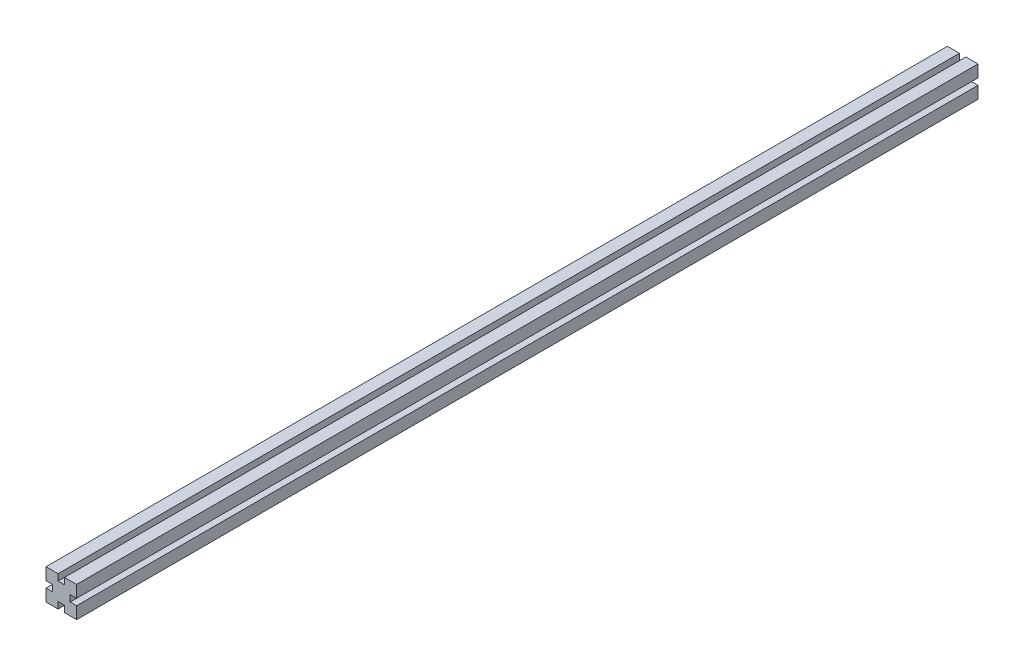
ISO-10303-21;
HEADER;
FILE_DESCRIPTION(('STEP AP214'),'2;1');
FILE_NAME('part.step','',(''),(''),'','','');
FILE_SCHEMA(('AUTOMOTIVE_DESIGN { 1 0 10303 214 1 1 1 1 }'));
ENDSEC;
DATA;
#1=APPLICATION_CONTEXT('core data for automotive mechanical design processes');
#2=APPLICATION_PROTOCOL_DEFINITION('international standard','automotive_design',2000,#1);
#3=PRODUCT_CONTEXT('',#1,'mechanical');
#4=PRODUCT('Part','Part','',(#3));
#5=PRODUCT_RELATED_PRODUCT_CATEGORY('part','',(#4));
#6=PRODUCT_DEFINITION_FORMATION('','',#4);
#7=PRODUCT_DEFINITION_CONTEXT('part definition',#1,'design');
#8=PRODUCT_DEFINITION('design','',#6,#7);
#9=PRODUCT_DEFINITION_SHAPE('','',#8);
#10=(LENGTH_UNIT() NAMED_UNIT(*) SI_UNIT(.MILLI.,.METRE.));
#11=(NAMED_UNIT(*) PLANE_ANGLE_UNIT() SI_UNIT($,.RADIAN.));
#12=(NAMED_UNIT(*) SI_UNIT($,.STERADIAN.) SOLID_ANGLE_UNIT());
#13=UNCERTAINTY_MEASURE_WITH_UNIT(LENGTH_MEASURE(1.E-05),#10,'distance_accuracy_value','');
#14=(GEOMETRIC_REPRESENTATION_CONTEXT(3) GLOBAL_UNCERTAINTY_ASSIGNED_CONTEXT((#13)) GLOBAL_UNIT_ASSIGNED_CONTEXT((#10,
#11,#12)) REPRESENTATION_CONTEXT('',''));
#15=CARTESIAN_POINT('',(0.,0.,0.));
#16=DIRECTION('',(0.,0.,1.));
#17=DIRECTION('',(1.,0.,0.));
#18=AXIS2_PLACEMENT_3D('',#15,#16,#17);
#19=CARTESIAN_POINT('',(-19.05,-4.,1122.));
#20=DIRECTION('',(1.,0.,0.));
#21=DIRECTION('',(0.,0.,-1.));
#22=AXIS2_PLACEMENT_3D('',#19,#20,#21);
#23=PLANE('',#22);
#24=DIRECTION('',(0.,-1.,0.));
#25=VECTOR('',#24,1.);
#26=CARTESIAN_POINT('',(-19.05,-4.,0.));
#27=LINE('',#26,#25);
#28=CARTESIAN_POINT('',(-19.05,-4.,0.));
#29=VERTEX_POINT('',#28);
#30=CARTESIAN_POINT('',(-19.05,-19.05,0.));
#31=VERTEX_POINT('',#30);
#32=EDGE_CURVE('E207',#29,#31,#27,.T.);
#33=ORIENTED_EDGE('',*,*,#32,.T.);
#34=DIRECTION('',(0.,0.,-1.));
#35=VECTOR('',#34,1.);
#36=CARTESIAN_POINT('',(-19.05,-19.05,1122.));
#37=LINE('',#36,#35);
#38=CARTESIAN_POINT('',(-19.05,-19.05,1122.));
#39=VERTEX_POINT('',#38);
#40=EDGE_CURVE('E11',#39,#31,#37,.T.);
#41=ORIENTED_EDGE('',*,*,#40,.F.);
#42=DIRECTION('',(0.,-1.,0.));
#43=VECTOR('',#42,1.);
#44=CARTESIAN_POINT('',(-19.05,-4.,1122.));
#45=LINE('',#44,#43);
#46=CARTESIAN_POINT('',(-19.05,-4.,1122.));
#47=VERTEX_POINT('',#46);
#48=EDGE_CURVE('E245',#47,#39,#45,.T.);
#49=ORIENTED_EDGE('',*,*,#48,.F.);
#50=DIRECTION('',(0.,0.,-1.));
#51=VECTOR('',#50,1.);
#52=CARTESIAN_POINT('',(-19.05,-4.,1122.));
#53=LINE('',#52,#51);
#54=EDGE_CURVE('E203',#47,#29,#53,.T.);
#55=ORIENTED_EDGE('',*,*,#54,.T.);
#56=EDGE_LOOP('',(#33,#41,#49,#55));
#57=FACE_BOUND('',#56,.T.);
#58=ADVANCED_FACE('F39',(#57),#23,.F.);
#59=CARTESIAN_POINT('',(-19.05,-19.05,1122.));
#60=DIRECTION('',(0.,1.,0.));
#61=DIRECTION('',(0.,0.,1.));
#62=AXIS2_PLACEMENT_3D('',#59,#60,#61);
#63=PLANE('',#62);
#64=DIRECTION('',(1.,0.,0.));
#65=VECTOR('',#64,1.);
#66=CARTESIAN_POINT('',(-19.05,-19.05,0.));
#67=LINE('',#66,#65);
#68=CARTESIAN_POINT('',(-4.,-19.05,0.));
#69=VERTEX_POINT('',#68);
#70=EDGE_CURVE('E210',#31,#69,#67,.T.);
#71=ORIENTED_EDGE('',*,*,#70,.T.);
#72=DIRECTION('',(0.,0.,-1.));
#73=VECTOR('',#72,1.);
#74=CARTESIAN_POINT('',(-4.,-19.05,1122.));
#75=LINE('',#74,#73);
#76=CARTESIAN_POINT('',(-4.,-19.05,1122.));
#77=VERTEX_POINT('',#76);
#78=EDGE_CURVE('E47',#77,#69,#75,.T.);
#79=ORIENTED_EDGE('',*,*,#78,.F.);
#80=DIRECTION('',(1.,0.,0.));
#81=VECTOR('',#80,1.);
#82=CARTESIAN_POINT('',(-19.05,-19.05,1122.));
#83=LINE('',#82,#81);
#84=EDGE_CURVE('E134',#39,#77,#83,.T.);
#85=ORIENTED_EDGE('',*,*,#84,.F.);
#86=ORIENTED_EDGE('',*,*,#40,.T.);
#87=EDGE_LOOP('',(#71,#79,#85,#86));
#88=FACE_BOUND('',#87,.T.);
#89=ADVANCED_FACE('F363',(#88),#63,.F.);
#90=CARTESIAN_POINT('',(-4.,-19.05,1122.));
#91=DIRECTION('',(-1.,0.,0.));
#92=DIRECTION('',(0.,0.,1.));
#93=AXIS2_PLACEMENT_3D('',#90,#91,#92);
#94=PLANE('',#93);
#95=DIRECTION('',(0.,1.,0.));
#96=VECTOR('',#95,1.);
#97=CARTESIAN_POINT('',(-4.,-19.05,0.));
#98=LINE('',#97,#96);
#99=CARTESIAN_POINT('',(-4.,-11.05,0.));
#100=VERTEX_POINT('',#99);
#101=EDGE_CURVE('E212',#69,#100,#98,.T.);
#102=ORIENTED_EDGE('',*,*,#101,.T.);
#103=DIRECTION('',(0.,0.,-1.));
#104=VECTOR('',#103,1.);
#105=CARTESIAN_POINT('',(-4.,-11.05,1122.));
#106=LINE('',#105,#104);
#107=CARTESIAN_POINT('',(-4.,-11.05,1122.));
#108=VERTEX_POINT('',#107);
#109=EDGE_CURVE('E288',#108,#100,#106,.T.);
#110=ORIENTED_EDGE('',*,*,#109,.F.);
#111=DIRECTION('',(0.,1.,0.));
#112=VECTOR('',#111,1.);
#113=CARTESIAN_POINT('',(-4.,-19.05,1122.));
#114=LINE('',#113,#112);
#115=EDGE_CURVE('E296',#77,#108,#114,.T.);
#116=ORIENTED_EDGE('',*,*,#115,.F.);
#117=ORIENTED_EDGE('',*,*,#78,.T.);
#118=EDGE_LOOP('',(#102,#110,#116,#117));
#119=FACE_BOUND('',#118,.T.);
#120=ADVANCED_FACE('F294',(#119),#94,.F.);
#121=CARTESIAN_POINT('',(-4.,-11.05,1122.));
#122=DIRECTION('',(0.,1.,0.));
#123=DIRECTION('',(0.,0.,1.));
#124=AXIS2_PLACEMENT_3D('',#121,#122,#123);
#125=PLANE('',#124);
#126=DIRECTION('',(1.,0.,0.));
#127=VECTOR('',#126,1.);
#128=CARTESIAN_POINT('',(-4.,-11.05,0.));
#129=LINE('',#128,#127);
#130=CARTESIAN_POINT('',(4.,-11.05,0.));
#131=VERTEX_POINT('',#130);
#132=EDGE_CURVE('E214',#100,#131,#129,.T.);
#133=ORIENTED_EDGE('',*,*,#132,.T.);
#134=DIRECTION('',(0.,0.,-1.));
#135=VECTOR('',#134,1.);
#136=CARTESIAN_POINT('',(4.,-11.05,1122.));
#137=LINE('',#136,#135);
#138=CARTESIAN_POINT('',(4.,-11.05,1122.));
#139=VERTEX_POINT('',#138);
#140=EDGE_CURVE('E285',#139,#131,#137,.T.);
#141=ORIENTED_EDGE('',*,*,#140,.F.);
#142=DIRECTION('',(1.,0.,0.));
#143=VECTOR('',#142,1.);
#144=CARTESIAN_POINT('',(-4.,-11.05,1122.));
#145=LINE('',#144,#143);
#146=EDGE_CURVE('E314',#108,#139,#145,.T.);
#147=ORIENTED_EDGE('',*,*,#146,.F.);
#148=ORIENTED_EDGE('',*,*,#109,.T.);
#149=EDGE_LOOP('',(#133,#141,#147,#148));
#150=FACE_BOUND('',#149,.T.);
#151=ADVANCED_FACE('F305',(#150),#125,.F.);
#152=CARTESIAN_POINT('',(4.,-11.05,1122.));
#153=DIRECTION('',(1.,0.,0.));
#154=DIRECTION('',(0.,0.,-1.));
#155=AXIS2_PLACEMENT_3D('',#152,#153,#154);
#156=PLANE('',#155);
#157=DIRECTION('',(0.,-1.,0.));
#158=VECTOR('',#157,1.);
#159=CARTESIAN_POINT('',(4.,-11.05,0.));
#160=LINE('',#159,#158);
#161=CARTESIAN_POINT('',(4.,-19.05,0.));
#162=VERTEX_POINT('',#161);
#163=EDGE_CURVE('E216',#131,#162,#160,.T.);
#164=ORIENTED_EDGE('',*,*,#163,.T.);
#165=DIRECTION('',(0.,0.,-1.));
#166=VECTOR('',#165,1.);
#167=CARTESIAN_POINT('',(4.,-19.05,1122.));
#168=LINE('',#167,#166);
#169=CARTESIAN_POINT('',(4.,-19.05,1122.));
#170=VERTEX_POINT('',#169);
#171=EDGE_CURVE('E282',#170,#162,#168,.T.);
#172=ORIENTED_EDGE('',*,*,#171,.F.);
#173=DIRECTION('',(0.,-1.,0.));
#174=VECTOR('',#173,1.);
#175=CARTESIAN_POINT('',(4.,-11.05,1122.));
#176=LINE('',#175,#174);
#177=EDGE_CURVE('E311',#139,#170,#176,.T.);
#178=ORIENTED_EDGE('',*,*,#177,.F.);
#179=ORIENTED_EDGE('',*,*,#140,.T.);
#180=EDGE_LOOP('',(#164,#172,#178,#179));
#181=FACE_BOUND('',#180,.T.);
#182=ADVANCED_FACE('F309',(#181),#156,.F.);
#183=CARTESIAN_POINT('',(4.,-19.05,1122.));
#184=DIRECTION('',(0.,1.,0.));
#185=DIRECTION('',(0.,0.,1.));
#186=AXIS2_PLACEMENT_3D('',#183,#184,#185);
#187=PLANE('',#186);
#188=DIRECTION('',(1.,0.,0.));
#189=VECTOR('',#188,1.);
#190=CARTESIAN_POINT('',(4.,-19.05,0.));
#191=LINE('',#190,#189);
#192=CARTESIAN_POINT('',(19.05,-19.05,0.));
#193=VERTEX_POINT('',#192);
#194=EDGE_CURVE('E218',#162,#193,#191,.T.);
#195=ORIENTED_EDGE('',*,*,#194,.T.);
#196=DIRECTION('',(0.,0.,-1.));
#197=VECTOR('',#196,1.);
#198=CARTESIAN_POINT('',(19.05,-19.05,1122.));
#199=LINE('',#198,#197);
#200=CARTESIAN_POINT('',(19.05,-19.05,1122.));
#201=VERTEX_POINT('',#200);
#202=EDGE_CURVE('E279',#201,#193,#199,.T.);
#203=ORIENTED_EDGE('',*,*,#202,.F.);
#204=DIRECTION('',(1.,0.,0.));
#205=VECTOR('',#204,1.);
#206=CARTESIAN_POINT('',(4.,-19.05,1122.));
#207=LINE('',#206,#205);
#208=EDGE_CURVE('E313',#170,#201,#207,.T.);
#209=ORIENTED_EDGE('',*,*,#208,.F.);
#210=ORIENTED_EDGE('',*,*,#171,.T.);
#211=EDGE_LOOP('',(#195,#203,#209,#210));
#212=FACE_BOUND('',#211,.T.);
#213=ADVANCED_FACE('F376',(#212),#187,.F.);
#214=CARTESIAN_POINT('',(19.05,-19.05,1122.));
#215=DIRECTION('',(-1.,0.,0.));
#216=DIRECTION('',(0.,0.,1.));
#217=AXIS2_PLACEMENT_3D('',#214,#215,#216);
#218=PLANE('',#217);
#219=DIRECTION('',(0.,1.,0.));
#220=VECTOR('',#219,1.);
#221=CARTESIAN_POINT('',(19.05,-19.05,0.));
#222=LINE('',#221,#220);
#223=CARTESIAN_POINT('',(19.05,-4.,0.));
#224=VERTEX_POINT('',#223);
#225=EDGE_CURVE('E220',#193,#224,#222,.T.);
#226=ORIENTED_EDGE('',*,*,#225,.T.);
#227=DIRECTION('',(0.,0.,-1.));
#228=VECTOR('',#227,1.);
#229=CARTESIAN_POINT('',(19.05,-4.,1122.));
#230=LINE('',#229,#228);
#231=CARTESIAN_POINT('',(19.05,-4.,1122.));
#232=VERTEX_POINT('',#231);
#233=EDGE_CURVE('E276',#232,#224,#230,.T.);
#234=ORIENTED_EDGE('',*,*,#233,.F.);
#235=DIRECTION('',(0.,1.,0.));
#236=VECTOR('',#235,1.);
#237=CARTESIAN_POINT('',(19.05,-19.05,1122.));
#238=LINE('',#237,#236);
#239=EDGE_CURVE('E316',#201,#232,#238,.T.);
#240=ORIENTED_EDGE('',*,*,#239,.F.);
#241=ORIENTED_EDGE('',*,*,#202,.T.);
#242=EDGE_LOOP('',(#226,#234,#240,#241));
#243=FACE_BOUND('',#242,.T.);
#244=ADVANCED_FACE('F379',(#243),#218,.F.);
#245=CARTESIAN_POINT('',(19.05,-4.,1122.));
#246=DIRECTION('',(0.,-1.,0.));
#247=DIRECTION('',(0.,0.,-1.));
#248=AXIS2_PLACEMENT_3D('',#245,#246,#247);
#249=PLANE('',#248);
#250=DIRECTION('',(-1.,0.,0.));
#251=VECTOR('',#250,1.);
#252=CARTESIAN_POINT('',(19.05,-4.,0.));
#253=LINE('',#252,#251);
#254=CARTESIAN_POINT('',(11.05,-4.,0.));
#255=VERTEX_POINT('',#254);
#256=EDGE_CURVE('E222',#224,#255,#253,.T.);
#257=ORIENTED_EDGE('',*,*,#256,.T.);
#258=DIRECTION('',(0.,0.,-1.));
#259=VECTOR('',#258,1.);
#260=CARTESIAN_POINT('',(11.05,-4.,1122.));
#261=LINE('',#260,#259);
#262=CARTESIAN_POINT('',(11.05,-4.,1122.));
#263=VERTEX_POINT('',#262);
#264=EDGE_CURVE('E273',#263,#255,#261,.T.);
#265=ORIENTED_EDGE('',*,*,#264,.F.);
#266=DIRECTION('',(-1.,0.,0.));
#267=VECTOR('',#266,1.);
#268=CARTESIAN_POINT('',(19.05,-4.,1122.));
#269=LINE('',#268,#267);
#270=EDGE_CURVE('E322',#232,#263,#269,.T.);
#271=ORIENTED_EDGE('',*,*,#270,.F.);
#272=ORIENTED_EDGE('',*,*,#233,.T.);
#273=EDGE_LOOP('',(#257,#265,#271,#272));
#274=FACE_BOUND('',#273,.T.);
#275=ADVANCED_FACE('F383',(#274),#249,.F.);
#276=CARTESIAN_POINT('',(11.05,-4.,1122.));
#277=DIRECTION('',(-1.,0.,0.));
#278=DIRECTION('',(0.,0.,1.));
#279=AXIS2_PLACEMENT_3D('',#276,#277,#278);
#280=PLANE('',#279);
#281=DIRECTION('',(0.,1.,0.));
#282=VECTOR('',#281,1.);
#283=CARTESIAN_POINT('',(11.05,-4.,0.));
#284=LINE('',#283,#282);
#285=CARTESIAN_POINT('',(11.05,4.,0.));
#286=VERTEX_POINT('',#285);
#287=EDGE_CURVE('E224',#255,#286,#284,.T.);
#288=ORIENTED_EDGE('',*,*,#287,.T.);
#289=DIRECTION('',(0.,0.,-1.));
#290=VECTOR('',#289,1.);
#291=CARTESIAN_POINT('',(11.05,4.,1122.));
#292=LINE('',#291,#290);
#293=CARTESIAN_POINT('',(11.05,4.,1122.));
#294=VERTEX_POINT('',#293);
#295=EDGE_CURVE('E270',#294,#286,#292,.T.);
#296=ORIENTED_EDGE('',*,*,#295,.F.);
#297=DIRECTION('',(0.,1.,0.));
#298=VECTOR('',#297,1.);
#299=CARTESIAN_POINT('',(11.05,-4.,1122.));
#300=LINE('',#299,#298);
#301=EDGE_CURVE('E324',#263,#294,#300,.T.);
#302=ORIENTED_EDGE('',*,*,#301,.F.);
#303=ORIENTED_EDGE('',*,*,#264,.T.);
#304=EDGE_LOOP('',(#288,#296,#302,#303));
#305=FACE_BOUND('',#304,.T.);
#306=ADVANCED_FACE('F387',(#305),#280,.F.);
#307=CARTESIAN_POINT('',(11.05,4.,1122.));
#308=DIRECTION('',(0.,1.,0.));
#309=DIRECTION('',(0.,0.,1.));
#310=AXIS2_PLACEMENT_3D('',#307,#308,#309);
#311=PLANE('',#310);
#312=DIRECTION('',(1.,0.,0.));
#313=VECTOR('',#312,1.);
#314=CARTESIAN_POINT('',(11.05,4.,0.));
#315=LINE('',#314,#313);
#316=CARTESIAN_POINT('',(19.05,4.,0.));
#317=VERTEX_POINT('',#316);
#318=EDGE_CURVE('E226',#286,#317,#315,.T.);
#319=ORIENTED_EDGE('',*,*,#318,.T.);
#320=DIRECTION('',(0.,0.,-1.));
#321=VECTOR('',#320,1.);
#322=CARTESIAN_POINT('',(19.05,4.,1122.));
#323=LINE('',#322,#321);
#324=CARTESIAN_POINT('',(19.05,4.,1122.));
#325=VERTEX_POINT('',#324);
#326=EDGE_CURVE('E267',#325,#317,#323,.T.);
#327=ORIENTED_EDGE('',*,*,#326,.F.);
#328=DIRECTION('',(1.,0.,0.));
#329=VECTOR('',#328,1.);
#330=CARTESIAN_POINT('',(11.05,4.,1122.));
#331=LINE('',#330,#329);
#332=EDGE_CURVE('E326',#294,#325,#331,.T.);
#333=ORIENTED_EDGE('',*,*,#332,.F.);
#334=ORIENTED_EDGE('',*,*,#295,.T.);
#335=EDGE_LOOP('',(#319,#327,#333,#334));
#336=FACE_BOUND('',#335,.T.);
#337=ADVANCED_FACE('F391',(#336),#311,.F.);
#338=CARTESIAN_POINT('',(19.05,4.,1122.));
#339=DIRECTION('',(-1.,0.,0.));
#340=DIRECTION('',(0.,0.,1.));
#341=AXIS2_PLACEMENT_3D('',#338,#339,#340);
#342=PLANE('',#341);
#343=DIRECTION('',(0.,1.,0.));
#344=VECTOR('',#343,1.);
#345=CARTESIAN_POINT('',(19.05,4.,0.));
#346=LINE('',#345,#344);
#347=CARTESIAN_POINT('',(19.05,19.05,0.));
#348=VERTEX_POINT('',#347);
#349=EDGE_CURVE('E228',#317,#348,#346,.T.);
#350=ORIENTED_EDGE('',*,*,#349,.T.);
#351=DIRECTION('',(0.,0.,-1.));
#352=VECTOR('',#351,1.);
#353=CARTESIAN_POINT('',(19.05,19.05,1122.));
#354=LINE('',#353,#352);
#355=CARTESIAN_POINT('',(19.05,19.05,1122.));
#356=VERTEX_POINT('',#355);
#357=EDGE_CURVE('E264',#356,#348,#354,.T.);
#358=ORIENTED_EDGE('',*,*,#357,.F.);
#359=DIRECTION('',(0.,1.,0.));
#360=VECTOR('',#359,1.);
#361=CARTESIAN_POINT('',(19.05,4.,1122.));
#362=LINE('',#361,#360);
#363=EDGE_CURVE('E328',#325,#356,#362,.T.);
#364=ORIENTED_EDGE('',*,*,#363,.F.);
#365=ORIENTED_EDGE('',*,*,#326,.T.);
#366=EDGE_LOOP('',(#350,#358,#364,#365));
#367=FACE_BOUND('',#366,.T.);
#368=ADVANCED_FACE('F395',(#367),#342,.F.);
#369=CARTESIAN_POINT('',(19.05,19.05,1122.));
#370=DIRECTION('',(0.,-1.,0.));
#371=DIRECTION('',(0.,0.,-1.));
#372=AXIS2_PLACEMENT_3D('',#369,#370,#371);
#373=PLANE('',#372);
#374=DIRECTION('',(-1.,0.,0.));
#375=VECTOR('',#374,1.);
#376=CARTESIAN_POINT('',(19.05,19.05,0.));
#377=LINE('',#376,#375);
#378=CARTESIAN_POINT('',(4.,19.05,0.));
#379=VERTEX_POINT('',#378);
#380=EDGE_CURVE('E230',#348,#379,#377,.T.);
#381=ORIENTED_EDGE('',*,*,#380,.T.);
#382=DIRECTION('',(0.,0.,-1.));
#383=VECTOR('',#382,1.);
#384=CARTESIAN_POINT('',(4.,19.05,1122.));
#385=LINE('',#384,#383);
#386=CARTESIAN_POINT('',(4.,19.05,1122.));
#387=VERTEX_POINT('',#386);
#388=EDGE_CURVE('E261',#387,#379,#385,.T.);
#389=ORIENTED_EDGE('',*,*,#388,.F.);
#390=DIRECTION('',(-1.,0.,0.));
#391=VECTOR('',#390,1.);
#392=CARTESIAN_POINT('',(19.05,19.05,1122.));
#393=LINE('',#392,#391);
#394=EDGE_CURVE('E330',#356,#387,#393,.T.);
#395=ORIENTED_EDGE('',*,*,#394,.F.);
#396=ORIENTED_EDGE('',*,*,#357,.T.);
#397=EDGE_LOOP('',(#381,#389,#395,#396));
#398=FACE_BOUND('',#397,.T.);
#399=ADVANCED_FACE('F399',(#398),#373,.F.);
#400=CARTESIAN_POINT('',(4.,19.05,1122.));
#401=DIRECTION('',(1.,0.,0.));
#402=DIRECTION('',(0.,0.,-1.));
#403=AXIS2_PLACEMENT_3D('',#400,#401,#402);
#404=PLANE('',#403);
#405=DIRECTION('',(0.,-1.,0.));
#406=VECTOR('',#405,1.);
#407=CARTESIAN_POINT('',(4.,19.05,0.));
#408=LINE('',#407,#406);
#409=CARTESIAN_POINT('',(4.,11.05,0.));
#410=VERTEX_POINT('',#409);
#411=EDGE_CURVE('E232',#379,#410,#408,.T.);
#412=ORIENTED_EDGE('',*,*,#411,.T.);
#413=DIRECTION('',(0.,0.,-1.));
#414=VECTOR('',#413,1.);
#415=CARTESIAN_POINT('',(4.,11.05,1122.));
#416=LINE('',#415,#414);
#417=CARTESIAN_POINT('',(4.,11.05,1122.));
#418=VERTEX_POINT('',#417);
#419=EDGE_CURVE('E258',#418,#410,#416,.T.);
#420=ORIENTED_EDGE('',*,*,#419,.F.);
#421=DIRECTION('',(0.,-1.,0.));
#422=VECTOR('',#421,1.);
#423=CARTESIAN_POINT('',(4.,19.05,1122.));
#424=LINE('',#423,#422);
#425=EDGE_CURVE('E332',#387,#418,#424,.T.);
#426=ORIENTED_EDGE('',*,*,#425,.F.);
#427=ORIENTED_EDGE('',*,*,#388,.T.);
#428=EDGE_LOOP('',(#412,#420,#426,#427));
#429=FACE_BOUND('',#428,.T.);
#430=ADVANCED_FACE('F403',(#429),#404,.F.);
#431=CARTESIAN_POINT('',(4.,11.05,1122.));
#432=DIRECTION('',(0.,-1.,0.));
#433=DIRECTION('',(0.,0.,-1.));
#434=AXIS2_PLACEMENT_3D('',#431,#432,#433);
#435=PLANE('',#434);
#436=DIRECTION('',(-1.,0.,0.));
#437=VECTOR('',#436,1.);
#438=CARTESIAN_POINT('',(4.,11.05,0.));
#439=LINE('',#438,#437);
#440=CARTESIAN_POINT('',(-4.,11.05,0.));
#441=VERTEX_POINT('',#440);
#442=EDGE_CURVE('E234',#410,#441,#439,.T.);
#443=ORIENTED_EDGE('',*,*,#442,.T.);
#444=DIRECTION('',(0.,0.,-1.));
#445=VECTOR('',#444,1.);
#446=CARTESIAN_POINT('',(-4.,11.05,1122.));
#447=LINE('',#446,#445);
#448=CARTESIAN_POINT('',(-4.,11.05,1122.));
#449=VERTEX_POINT('',#448);
#450=EDGE_CURVE('E255',#449,#441,#447,.T.);
#451=ORIENTED_EDGE('',*,*,#450,.F.);
#452=DIRECTION('',(-1.,0.,0.));
#453=VECTOR('',#452,1.);
#454=CARTESIAN_POINT('',(4.,11.05,1122.));
#455=LINE('',#454,#453);
#456=EDGE_CURVE('E334',#418,#449,#455,.T.);
#457=ORIENTED_EDGE('',*,*,#456,.F.);
#458=ORIENTED_EDGE('',*,*,#419,.T.);
#459=EDGE_LOOP('',(#443,#451,#457,#458));
#460=FACE_BOUND('',#459,.T.);
#461=ADVANCED_FACE('F407',(#460),#435,.F.);
#462=CARTESIAN_POINT('',(-4.,11.05,1122.));
#463=DIRECTION('',(-1.,0.,0.));
#464=DIRECTION('',(0.,0.,1.));
#465=AXIS2_PLACEMENT_3D('',#462,#463,#464);
#466=PLANE('',#465);
#467=DIRECTION('',(0.,1.,0.));
#468=VECTOR('',#467,1.);
#469=CARTESIAN_POINT('',(-4.,11.05,0.));
#470=LINE('',#469,#468);
#471=CARTESIAN_POINT('',(-4.,19.05,0.));
#472=VERTEX_POINT('',#471);
#473=EDGE_CURVE('E236',#441,#472,#470,.T.);
#474=ORIENTED_EDGE('',*,*,#473,.T.);
#475=DIRECTION('',(0.,0.,-1.));
#476=VECTOR('',#475,1.);
#477=CARTESIAN_POINT('',(-4.,19.05,1122.));
#478=LINE('',#477,#476);
#479=CARTESIAN_POINT('',(-4.,19.05,1122.));
#480=VERTEX_POINT('',#479);
#481=EDGE_CURVE('E252',#480,#472,#478,.T.);
#482=ORIENTED_EDGE('',*,*,#481,.F.);
#483=DIRECTION('',(0.,1.,0.));
#484=VECTOR('',#483,1.);
#485=CARTESIAN_POINT('',(-4.,11.05,1122.));
#486=LINE('',#485,#484);
#487=EDGE_CURVE('E336',#449,#480,#486,.T.);
#488=ORIENTED_EDGE('',*,*,#487,.F.);
#489=ORIENTED_EDGE('',*,*,#450,.T.);
#490=EDGE_LOOP('',(#474,#482,#488,#489));
#491=FACE_BOUND('',#490,.T.);
#492=ADVANCED_FACE('F411',(#491),#466,.F.);
#493=CARTESIAN_POINT('',(-4.,19.05,1122.));
#494=DIRECTION('',(0.,-1.,0.));
#495=DIRECTION('',(0.,0.,-1.));
#496=AXIS2_PLACEMENT_3D('',#493,#494,#495);
#497=PLANE('',#496);
#498=DIRECTION('',(-1.,0.,0.));
#499=VECTOR('',#498,1.);
#500=CARTESIAN_POINT('',(-4.,19.05,0.));
#501=LINE('',#500,#499);
#502=CARTESIAN_POINT('',(-19.05,19.05,0.));
#503=VERTEX_POINT('',#502);
#504=EDGE_CURVE('E238',#472,#503,#501,.T.);
#505=ORIENTED_EDGE('',*,*,#504,.T.);
#506=DIRECTION('',(0.,0.,-1.));
#507=VECTOR('',#506,1.);
#508=CARTESIAN_POINT('',(-19.05,19.05,1122.));
#509=LINE('',#508,#507);
#510=CARTESIAN_POINT('',(-19.05,19.05,1122.));
#511=VERTEX_POINT('',#510);
#512=EDGE_CURVE('E249',#511,#503,#509,.T.);
#513=ORIENTED_EDGE('',*,*,#512,.F.);
#514=DIRECTION('',(-1.,0.,0.));
#515=VECTOR('',#514,1.);
#516=CARTESIAN_POINT('',(-4.,19.05,1122.));
#517=LINE('',#516,#515);
#518=EDGE_CURVE('E338',#480,#511,#517,.T.);
#519=ORIENTED_EDGE('',*,*,#518,.F.);
#520=ORIENTED_EDGE('',*,*,#481,.T.);
#521=EDGE_LOOP('',(#505,#513,#519,#520));
#522=FACE_BOUND('',#521,.T.);
#523=ADVANCED_FACE('F344',(#522),#497,.F.);
#524=CARTESIAN_POINT('',(-19.05,19.05,1122.));
#525=DIRECTION('',(1.,0.,0.));
#526=DIRECTION('',(0.,0.,-1.));
#527=AXIS2_PLACEMENT_3D('',#524,#525,#526);
#528=PLANE('',#527);
#529=DIRECTION('',(0.,-1.,0.));
#530=VECTOR('',#529,1.);
#531=CARTESIAN_POINT('',(-19.05,19.05,0.));
#532=LINE('',#531,#530);
#533=CARTESIAN_POINT('',(-19.05,4.,0.));
#534=VERTEX_POINT('',#533);
#535=EDGE_CURVE('E240',#503,#534,#532,.T.);
#536=ORIENTED_EDGE('',*,*,#535,.T.);
#537=DIRECTION('',(0.,0.,-1.));
#538=VECTOR('',#537,1.);
#539=CARTESIAN_POINT('',(-19.05,4.,1122.));
#540=LINE('',#539,#538);
#541=CARTESIAN_POINT('',(-19.05,4.,1122.));
#542=VERTEX_POINT('',#541);
#543=EDGE_CURVE('E198',#542,#534,#540,.T.);
#544=ORIENTED_EDGE('',*,*,#543,.F.);
#545=DIRECTION('',(0.,-1.,0.));
#546=VECTOR('',#545,1.);
#547=CARTESIAN_POINT('',(-19.05,19.05,1122.));
#548=LINE('',#547,#546);
#549=EDGE_CURVE('E189',#511,#542,#548,.T.);
#550=ORIENTED_EDGE('',*,*,#549,.F.);
#551=ORIENTED_EDGE('',*,*,#512,.T.);
#552=EDGE_LOOP('',(#536,#544,#550,#551));
#553=FACE_BOUND('',#552,.T.);
#554=ADVANCED_FACE('F348',(#553),#528,.F.);
#555=CARTESIAN_POINT('',(-19.05,4.,1122.));
#556=DIRECTION('',(0.,1.,0.));
#557=DIRECTION('',(0.,0.,1.));
#558=AXIS2_PLACEMENT_3D('',#555,#556,#557);
#559=PLANE('',#558);
#560=DIRECTION('',(1.,0.,0.));
#561=VECTOR('',#560,1.);
#562=CARTESIAN_POINT('',(-19.05,4.,0.));
#563=LINE('',#562,#561);
#564=CARTESIAN_POINT('',(-11.05,4.,0.));
#565=VERTEX_POINT('',#564);
#566=EDGE_CURVE('E197',#534,#565,#563,.T.);
#567=ORIENTED_EDGE('',*,*,#566,.T.);
#568=DIRECTION('',(0.,0.,-1.));
#569=VECTOR('',#568,1.);
#570=CARTESIAN_POINT('',(-11.05,4.,1122.));
#571=LINE('',#570,#569);
#572=CARTESIAN_POINT('',(-11.05,4.,1122.));
#573=VERTEX_POINT('',#572);
#574=EDGE_CURVE('E194',#573,#565,#571,.T.);
#575=ORIENTED_EDGE('',*,*,#574,.F.);
#576=DIRECTION('',(1.,0.,0.));
#577=VECTOR('',#576,1.);
#578=CARTESIAN_POINT('',(-19.05,4.,1122.));
#579=LINE('',#578,#577);
#580=EDGE_CURVE('E183',#542,#573,#579,.T.);
#581=ORIENTED_EDGE('',*,*,#580,.F.);
#582=ORIENTED_EDGE('',*,*,#543,.T.);
#583=EDGE_LOOP('',(#567,#575,#581,#582));
#584=FACE_BOUND('',#583,.T.);
#585=ADVANCED_FACE('F195',(#584),#559,.F.);
#586=CARTESIAN_POINT('',(-11.05,4.,1122.));
#587=DIRECTION('',(1.,0.,0.));
#588=DIRECTION('',(0.,0.,-1.));
#589=AXIS2_PLACEMENT_3D('',#586,#587,#588);
#590=PLANE('',#589);
#591=DIRECTION('',(0.,-1.,0.));
#592=VECTOR('',#591,1.);
#593=CARTESIAN_POINT('',(-11.05,4.,0.));
#594=LINE('',#593,#592);
#595=CARTESIAN_POINT('',(-11.05,-4.,0.));
#596=VERTEX_POINT('',#595);
#597=EDGE_CURVE('E120',#565,#596,#594,.T.);
#598=ORIENTED_EDGE('',*,*,#597,.T.);
#599=DIRECTION('',(0.,0.,-1.));
#600=VECTOR('',#599,1.);
#601=CARTESIAN_POINT('',(-11.05,-4.,1122.));
#602=LINE('',#601,#600);
#603=CARTESIAN_POINT('',(-11.05,-4.,1122.));
#604=VERTEX_POINT('',#603);
#605=EDGE_CURVE('E199',#604,#596,#602,.T.);
#606=ORIENTED_EDGE('',*,*,#605,.F.);
#607=DIRECTION('',(0.,-1.,0.));
#608=VECTOR('',#607,1.);
#609=CARTESIAN_POINT('',(-11.05,4.,1122.));
#610=LINE('',#609,#608);
#611=EDGE_CURVE('E187',#573,#604,#610,.T.);
#612=ORIENTED_EDGE('',*,*,#611,.F.);
#613=ORIENTED_EDGE('',*,*,#574,.T.);
#614=EDGE_LOOP('',(#598,#606,#612,#613));
#615=FACE_BOUND('',#614,.T.);
#616=ADVANCED_FACE('F201',(#615),#590,.F.);
#617=CARTESIAN_POINT('',(-11.05,-4.,1122.));
#618=DIRECTION('',(0.,-1.,0.));
#619=DIRECTION('',(0.,0.,-1.));
#620=AXIS2_PLACEMENT_3D('',#617,#618,#619);
#621=PLANE('',#620);
#622=DIRECTION('',(-1.,0.,0.));
#623=VECTOR('',#622,1.);
#624=CARTESIAN_POINT('',(-11.05,-4.,0.));
#625=LINE('',#624,#623);
#626=EDGE_CURVE('E126',#596,#29,#625,.T.);
#627=ORIENTED_EDGE('',*,*,#626,.T.);
#628=ORIENTED_EDGE('',*,*,#54,.F.);
#629=DIRECTION('',(-1.,0.,0.));
#630=VECTOR('',#629,1.);
#631=CARTESIAN_POINT('',(-11.05,-4.,1122.));
#632=LINE('',#631,#630);
#633=EDGE_CURVE('E55',#604,#47,#632,.T.);
#634=ORIENTED_EDGE('',*,*,#633,.F.);
#635=ORIENTED_EDGE('',*,*,#605,.T.);
#636=EDGE_LOOP('',(#627,#628,#634,#635));
#637=FACE_BOUND('',#636,.T.);
#638=ADVANCED_FACE('F352',(#637),#621,.F.);
#639=CARTESIAN_POINT('',(0.,0.,1122.));
#640=DIRECTION('',(0.,0.,1.));
#641=DIRECTION('',(1.,0.,0.));
#642=AXIS2_PLACEMENT_3D('',#639,#640,#641);
#643=PLANE('',#642);
#644=ORIENTED_EDGE('',*,*,#48,.T.);
#645=ORIENTED_EDGE('',*,*,#84,.T.);
#646=ORIENTED_EDGE('',*,*,#115,.T.);
#647=ORIENTED_EDGE('',*,*,#146,.T.);
#648=ORIENTED_EDGE('',*,*,#177,.T.);
#649=ORIENTED_EDGE('',*,*,#208,.T.);
#650=ORIENTED_EDGE('',*,*,#239,.T.);
#651=ORIENTED_EDGE('',*,*,#270,.T.);
#652=ORIENTED_EDGE('',*,*,#301,.T.);
#653=ORIENTED_EDGE('',*,*,#332,.T.);
#654=ORIENTED_EDGE('',*,*,#363,.T.);
#655=ORIENTED_EDGE('',*,*,#394,.T.);
#656=ORIENTED_EDGE('',*,*,#425,.T.);
#657=ORIENTED_EDGE('',*,*,#456,.T.);
#658=ORIENTED_EDGE('',*,*,#487,.T.);
#659=ORIENTED_EDGE('',*,*,#518,.T.);
#660=ORIENTED_EDGE('',*,*,#549,.T.);
#661=ORIENTED_EDGE('',*,*,#580,.T.);
#662=ORIENTED_EDGE('',*,*,#611,.T.);
#663=ORIENTED_EDGE('',*,*,#633,.T.);
#664=EDGE_LOOP('',(#644,#645,#646,#647,#648,#649,#650,#651,#652,#653,#654,#655,#656,#657,#658,
#659,#660,#661,#662,#663));
#665=FACE_BOUND('',#664,.T.);
#666=ADVANCED_FACE('F185',(#665),#643,.T.);
#667=CARTESIAN_POINT('',(0.,0.,0.));
#668=DIRECTION('',(0.,0.,1.));
#669=DIRECTION('',(1.,0.,0.));
#670=AXIS2_PLACEMENT_3D('',#667,#668,#669);
#671=PLANE('',#670);
#672=ORIENTED_EDGE('',*,*,#32,.F.);
#673=ORIENTED_EDGE('',*,*,#626,.F.);
#674=ORIENTED_EDGE('',*,*,#597,.F.);
#675=ORIENTED_EDGE('',*,*,#566,.F.);
#676=ORIENTED_EDGE('',*,*,#535,.F.);
#677=ORIENTED_EDGE('',*,*,#504,.F.);
#678=ORIENTED_EDGE('',*,*,#473,.F.);
#679=ORIENTED_EDGE('',*,*,#442,.F.);
#680=ORIENTED_EDGE('',*,*,#411,.F.);
#681=ORIENTED_EDGE('',*,*,#380,.F.);
#682=ORIENTED_EDGE('',*,*,#349,.F.);
#683=ORIENTED_EDGE('',*,*,#318,.F.);
#684=ORIENTED_EDGE('',*,*,#287,.F.);
#685=ORIENTED_EDGE('',*,*,#256,.F.);
#686=ORIENTED_EDGE('',*,*,#225,.F.);
#687=ORIENTED_EDGE('',*,*,#194,.F.);
#688=ORIENTED_EDGE('',*,*,#163,.F.);
#689=ORIENTED_EDGE('',*,*,#132,.F.);
#690=ORIENTED_EDGE('',*,*,#101,.F.);
#691=ORIENTED_EDGE('',*,*,#70,.F.);
#692=EDGE_LOOP('',(#672,#673,#674,#675,#676,#677,#678,#679,#680,#681,#682,#683,#684,#685,#686,
#687,#688,#689,#690,#691));
#693=FACE_BOUND('',#692,.T.);
#694=ADVANCED_FACE('F300',(#693),#671,.F.);
#695=CLOSED_SHELL('',(#58,#89,#120,#151,#182,#213,#244,#275,#306,#337,#368,#399,#430,#461,#492,
#523,#554,#585,#616,#638,#666,#694));
#696=MANIFOLD_SOLID_BREP('B2',#695);
#697=ADVANCED_BREP_SHAPE_REPRESENTATION('',(#18,#696),#14);
#698=SHAPE_DEFINITION_REPRESENTATION(#9,#697);
ENDSEC;
END-ISO-10303-21;
